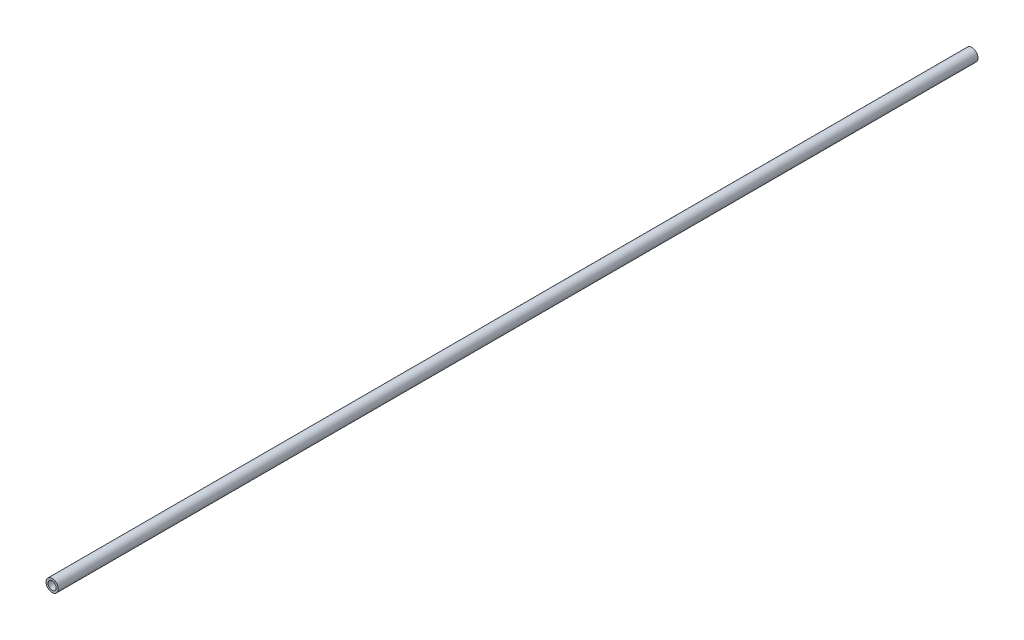
ISO-10303-21;
HEADER;
FILE_DESCRIPTION(('STEP AP214'),'2;1');
FILE_NAME('part.step','',(''),(''),'','','');
FILE_SCHEMA(('AUTOMOTIVE_DESIGN { 1 0 10303 214 1 1 1 1 }'));
ENDSEC;
DATA;
#1=APPLICATION_CONTEXT('core data for automotive mechanical design processes');
#2=APPLICATION_PROTOCOL_DEFINITION('international standard','automotive_design',2000,#1);
#3=PRODUCT_CONTEXT('',#1,'mechanical');
#4=PRODUCT('Part','Part','',(#3));
#5=PRODUCT_RELATED_PRODUCT_CATEGORY('part','',(#4));
#6=PRODUCT_DEFINITION_FORMATION('','',#4);
#7=PRODUCT_DEFINITION_CONTEXT('part definition',#1,'design');
#8=PRODUCT_DEFINITION('design','',#6,#7);
#9=PRODUCT_DEFINITION_SHAPE('','',#8);
#10=(LENGTH_UNIT() NAMED_UNIT(*) SI_UNIT(.MILLI.,.METRE.));
#11=(NAMED_UNIT(*) PLANE_ANGLE_UNIT() SI_UNIT($,.RADIAN.));
#12=(NAMED_UNIT(*) SI_UNIT($,.STERADIAN.) SOLID_ANGLE_UNIT());
#13=UNCERTAINTY_MEASURE_WITH_UNIT(LENGTH_MEASURE(1.E-05),#10,'distance_accuracy_value','');
#14=(GEOMETRIC_REPRESENTATION_CONTEXT(3) GLOBAL_UNCERTAINTY_ASSIGNED_CONTEXT((#13)) GLOBAL_UNIT_ASSIGNED_CONTEXT((#10,
#11,#12)) REPRESENTATION_CONTEXT('',''));
#15=CARTESIAN_POINT('',(0.,0.,0.));
#16=DIRECTION('',(0.,0.,1.));
#17=DIRECTION('',(1.,0.,0.));
#18=AXIS2_PLACEMENT_3D('',#15,#16,#17);
#19=CARTESIAN_POINT('',(0.,0.,450.));
#20=DIRECTION('',(0.,0.,1.));
#21=DIRECTION('',(1.,0.,0.));
#22=AXIS2_PLACEMENT_3D('',#19,#20,#21);
#23=PLANE('',#22);
#24=CARTESIAN_POINT('',(0.,0.,450.));
#25=DIRECTION('',(0.,0.,1.));
#26=DIRECTION('',(1.,0.,0.));
#27=AXIS2_PLACEMENT_3D('',#24,#25,#26);
#28=CIRCLE('',#27,3.);
#29=CARTESIAN_POINT('',(3.,0.,450.));
#30=VERTEX_POINT('',#29);
#31=EDGE_CURVE('E10',#30,#30,#28,.T.);
#32=ORIENTED_EDGE('',*,*,#31,.T.);
#33=EDGE_LOOP('',(#32));
#34=FACE_BOUND('',#33,.T.);
#35=CARTESIAN_POINT('',(0.,0.,450.));
#36=DIRECTION('',(0.,0.,1.));
#37=DIRECTION('',(1.,0.,0.));
#38=AXIS2_PLACEMENT_3D('',#35,#36,#37);
#39=CIRCLE('',#38,2.);
#40=CARTESIAN_POINT('',(2.,0.,450.));
#41=VERTEX_POINT('',#40);
#42=EDGE_CURVE('E46',#41,#41,#39,.T.);
#43=ORIENTED_EDGE('',*,*,#42,.F.);
#44=EDGE_LOOP('',(#43));
#45=FACE_BOUND('',#44,.T.);
#46=ADVANCED_FACE('F35',(#34,#45),#23,.T.);
#47=CARTESIAN_POINT('',(0.,0.,0.));
#48=DIRECTION('',(0.,0.,1.));
#49=DIRECTION('',(1.,0.,0.));
#50=AXIS2_PLACEMENT_3D('',#47,#48,#49);
#51=PLANE('',#50);
#52=CARTESIAN_POINT('',(0.,0.,0.));
#53=DIRECTION('',(0.,0.,1.));
#54=DIRECTION('',(1.,0.,0.));
#55=AXIS2_PLACEMENT_3D('',#52,#53,#54);
#56=CIRCLE('',#55,3.);
#57=CARTESIAN_POINT('',(3.,0.,0.));
#58=VERTEX_POINT('',#57);
#59=EDGE_CURVE('E39',#58,#58,#56,.T.);
#60=ORIENTED_EDGE('',*,*,#59,.F.);
#61=EDGE_LOOP('',(#60));
#62=FACE_BOUND('',#61,.T.);
#63=CARTESIAN_POINT('',(0.,0.,0.));
#64=DIRECTION('',(0.,0.,1.));
#65=DIRECTION('',(1.,0.,0.));
#66=AXIS2_PLACEMENT_3D('',#63,#64,#65);
#67=CIRCLE('',#66,2.);
#68=CARTESIAN_POINT('',(2.,0.,0.));
#69=VERTEX_POINT('',#68);
#70=EDGE_CURVE('E48',#69,#69,#67,.T.);
#71=ORIENTED_EDGE('',*,*,#70,.T.);
#72=EDGE_LOOP('',(#71));
#73=FACE_BOUND('',#72,.T.);
#74=ADVANCED_FACE('F58',(#62,#73),#51,.F.);
#75=CARTESIAN_POINT('',(0.,0.,450.));
#76=DIRECTION('',(0.,0.,-1.));
#77=DIRECTION('',(-1.,0.,0.));
#78=AXIS2_PLACEMENT_3D('',#75,#76,#77);
#79=CYLINDRICAL_SURFACE('',#78,3.);
#80=ORIENTED_EDGE('',*,*,#31,.F.);
#81=EDGE_LOOP('',(#80));
#82=FACE_BOUND('',#81,.T.);
#83=ORIENTED_EDGE('',*,*,#59,.T.);
#84=EDGE_LOOP('',(#83));
#85=FACE_BOUND('',#84,.T.);
#86=ADVANCED_FACE('F37',(#82,#85),#79,.T.);
#87=CARTESIAN_POINT('',(0.,0.,450.));
#88=DIRECTION('',(0.,0.,-1.));
#89=DIRECTION('',(-1.,0.,0.));
#90=AXIS2_PLACEMENT_3D('',#87,#88,#89);
#91=CYLINDRICAL_SURFACE('',#90,2.);
#92=ORIENTED_EDGE('',*,*,#42,.T.);
#93=EDGE_LOOP('',(#92));
#94=FACE_BOUND('',#93,.T.);
#95=ORIENTED_EDGE('',*,*,#70,.F.);
#96=EDGE_LOOP('',(#95));
#97=FACE_BOUND('',#96,.T.);
#98=ADVANCED_FACE('F54',(#94,#97),#91,.F.);
#99=CLOSED_SHELL('',(#46,#74,#86,#98));
#100=MANIFOLD_SOLID_BREP('B2',#99);
#101=ADVANCED_BREP_SHAPE_REPRESENTATION('',(#18,#100),#14);
#102=SHAPE_DEFINITION_REPRESENTATION(#9,#101);
ENDSEC;
END-ISO-10303-21;
